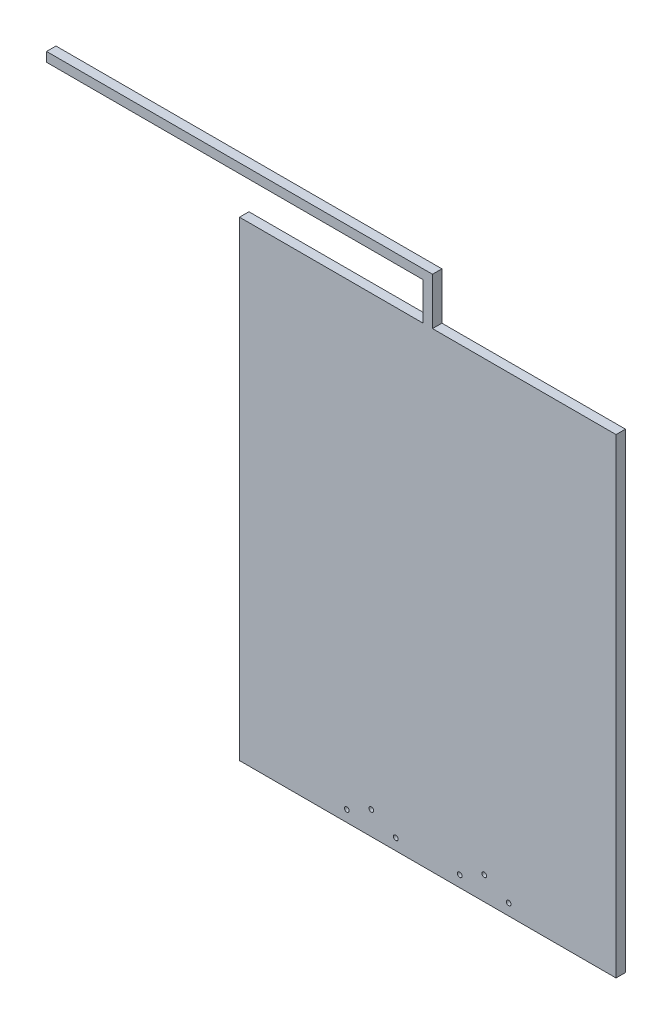
ISO-10303-21;
HEADER;
FILE_DESCRIPTION(('STEP AP214'),'2;1');
FILE_NAME('part.step','',(''),(''),'','','');
FILE_SCHEMA(('AUTOMOTIVE_DESIGN { 1 0 10303 214 1 1 1 1 }'));
ENDSEC;
DATA;
#1=APPLICATION_CONTEXT('core data for automotive mechanical design processes');
#2=APPLICATION_PROTOCOL_DEFINITION('international standard','automotive_design',2000,#1);
#3=PRODUCT_CONTEXT('',#1,'mechanical');
#4=PRODUCT('Part','Part','',(#3));
#5=PRODUCT_RELATED_PRODUCT_CATEGORY('part','',(#4));
#6=PRODUCT_DEFINITION_FORMATION('','',#4);
#7=PRODUCT_DEFINITION_CONTEXT('part definition',#1,'design');
#8=PRODUCT_DEFINITION('design','',#6,#7);
#9=PRODUCT_DEFINITION_SHAPE('','',#8);
#10=(LENGTH_UNIT() NAMED_UNIT(*) SI_UNIT(.MILLI.,.METRE.));
#11=(NAMED_UNIT(*) PLANE_ANGLE_UNIT() SI_UNIT($,.RADIAN.));
#12=(NAMED_UNIT(*) SI_UNIT($,.STERADIAN.) SOLID_ANGLE_UNIT());
#13=UNCERTAINTY_MEASURE_WITH_UNIT(LENGTH_MEASURE(1.E-05),#10,'distance_accuracy_value','');
#14=(GEOMETRIC_REPRESENTATION_CONTEXT(3) GLOBAL_UNCERTAINTY_ASSIGNED_CONTEXT((#13)) GLOBAL_UNIT_ASSIGNED_CONTEXT((#10,
#11,#12)) REPRESENTATION_CONTEXT('',''));
#15=CARTESIAN_POINT('',(0.,0.,0.));
#16=DIRECTION('',(0.,0.,1.));
#17=DIRECTION('',(1.,0.,0.));
#18=AXIS2_PLACEMENT_3D('',#15,#16,#17);
#19=CARTESIAN_POINT('',(-5.,300.,0.));
#20=DIRECTION('',(1.,0.,0.));
#21=DIRECTION('',(0.,1.,0.));
#22=AXIS2_PLACEMENT_3D('',#19,#20,#21);
#23=PLANE('',#22);
#24=DIRECTION('',(0.,0.,1.));
#25=VECTOR('',#24,1.);
#26=CARTESIAN_POINT('',(-5.,290.,0.));
#27=LINE('',#26,#25);
#28=CARTESIAN_POINT('',(-5.,290.,0.));
#29=VERTEX_POINT('',#28);
#30=CARTESIAN_POINT('',(-5.,290.,10.));
#31=VERTEX_POINT('',#30);
#32=EDGE_CURVE('E138',#29,#31,#27,.T.);
#33=ORIENTED_EDGE('',*,*,#32,.F.);
#34=DIRECTION('',(0.,-1.,0.));
#35=VECTOR('',#34,1.);
#36=CARTESIAN_POINT('',(-5.,300.,0.));
#37=LINE('',#36,#35);
#38=CARTESIAN_POINT('',(-4.99999999999998,250.,0.));
#39=VERTEX_POINT('',#38);
#40=EDGE_CURVE('E56',#29,#39,#37,.T.);
#41=ORIENTED_EDGE('',*,*,#40,.T.);
#42=DIRECTION('',(0.,0.,1.));
#43=VECTOR('',#42,1.);
#44=CARTESIAN_POINT('',(-4.99999999999999,250.,0.));
#45=LINE('',#44,#43);
#46=CARTESIAN_POINT('',(-4.99999999999999,250.,10.));
#47=VERTEX_POINT('',#46);
#48=EDGE_CURVE('E154',#39,#47,#45,.T.);
#49=ORIENTED_EDGE('',*,*,#48,.T.);
#50=DIRECTION('',(0.,-1.,0.));
#51=VECTOR('',#50,1.);
#52=CARTESIAN_POINT('',(-5.,300.,10.));
#53=LINE('',#52,#51);
#54=EDGE_CURVE('E159',#31,#47,#53,.T.);
#55=ORIENTED_EDGE('',*,*,#54,.F.);
#56=EDGE_LOOP('',(#33,#41,#49,#55));
#57=FACE_BOUND('',#56,.T.);
#58=ADVANCED_FACE('F33',(#57),#23,.F.);
#59=CARTESIAN_POINT('',(200.,250.,10.));
#60=DIRECTION('',(0.,-1.,0.));
#61=DIRECTION('',(1.,0.,0.));
#62=AXIS2_PLACEMENT_3D('',#59,#60,#61);
#63=PLANE('',#62);
#64=DIRECTION('',(0.,0.,-1.));
#65=VECTOR('',#64,1.);
#66=CARTESIAN_POINT('',(5.00000000000002,250.,0.));
#67=LINE('',#66,#65);
#68=CARTESIAN_POINT('',(5.,250.,10.));
#69=VERTEX_POINT('',#68);
#70=CARTESIAN_POINT('',(5.,250.,0.));
#71=VERTEX_POINT('',#70);
#72=EDGE_CURVE('E48',#69,#71,#67,.T.);
#73=ORIENTED_EDGE('',*,*,#72,.F.);
#74=DIRECTION('',(-1.,0.,0.));
#75=VECTOR('',#74,1.);
#76=CARTESIAN_POINT('',(200.,250.,10.));
#77=LINE('',#76,#75);
#78=CARTESIAN_POINT('',(200.,250.,10.));
#79=VERTEX_POINT('',#78);
#80=EDGE_CURVE('E210',#79,#69,#77,.T.);
#81=ORIENTED_EDGE('',*,*,#80,.F.);
#82=DIRECTION('',(0.,0.,-1.));
#83=VECTOR('',#82,1.);
#84=CARTESIAN_POINT('',(200.,250.,10.));
#85=LINE('',#84,#83);
#86=CARTESIAN_POINT('',(200.,250.,0.));
#87=VERTEX_POINT('',#86);
#88=EDGE_CURVE('E223',#79,#87,#85,.T.);
#89=ORIENTED_EDGE('',*,*,#88,.T.);
#90=DIRECTION('',(-1.,0.,0.));
#91=VECTOR('',#90,1.);
#92=CARTESIAN_POINT('',(200.,250.,0.));
#93=LINE('',#92,#91);
#94=EDGE_CURVE('E205',#87,#71,#93,.T.);
#95=ORIENTED_EDGE('',*,*,#94,.T.);
#96=EDGE_LOOP('',(#73,#81,#89,#95));
#97=FACE_BOUND('',#96,.T.);
#98=ADVANCED_FACE('F238',(#97),#63,.F.);
#99=ORIENTED_EDGE('',*,*,#48,.F.);
#100=CARTESIAN_POINT('',(-200.,250.,0.));
#101=VERTEX_POINT('',#100);
#102=EDGE_CURVE('E219',#39,#101,#93,.T.);
#103=ORIENTED_EDGE('',*,*,#102,.T.);
#104=DIRECTION('',(0.,0.,-1.));
#105=VECTOR('',#104,1.);
#106=CARTESIAN_POINT('',(-200.,250.,10.));
#107=LINE('',#106,#105);
#108=CARTESIAN_POINT('',(-200.,250.,10.));
#109=VERTEX_POINT('',#108);
#110=EDGE_CURVE('E212',#109,#101,#107,.T.);
#111=ORIENTED_EDGE('',*,*,#110,.F.);
#112=EDGE_CURVE('E209',#47,#109,#77,.T.);
#113=ORIENTED_EDGE('',*,*,#112,.F.);
#114=EDGE_LOOP('',(#99,#103,#111,#113));
#115=FACE_BOUND('',#114,.T.);
#116=ADVANCED_FACE('F261',(#115),#63,.F.);
#117=CARTESIAN_POINT('',(-200.,-250.,10.));
#118=DIRECTION('',(1.,0.,0.));
#119=DIRECTION('',(0.,0.,-1.));
#120=AXIS2_PLACEMENT_3D('',#117,#118,#119);
#121=PLANE('',#120);
#122=DIRECTION('',(0.,-1.,0.));
#123=VECTOR('',#122,1.);
#124=CARTESIAN_POINT('',(-200.,-250.,0.));
#125=LINE('',#124,#123);
#126=CARTESIAN_POINT('',(-200.,-250.,0.));
#127=VERTEX_POINT('',#126);
#128=EDGE_CURVE('E199',#101,#127,#125,.T.);
#129=ORIENTED_EDGE('',*,*,#128,.T.);
#130=DIRECTION('',(0.,0.,-1.));
#131=VECTOR('',#130,1.);
#132=CARTESIAN_POINT('',(-200.,-250.,10.));
#133=LINE('',#132,#131);
#134=CARTESIAN_POINT('',(-200.,-250.,10.));
#135=VERTEX_POINT('',#134);
#136=EDGE_CURVE('E11',#135,#127,#133,.T.);
#137=ORIENTED_EDGE('',*,*,#136,.F.);
#138=DIRECTION('',(0.,-1.,0.));
#139=VECTOR('',#138,1.);
#140=CARTESIAN_POINT('',(-200.,-250.,10.));
#141=LINE('',#140,#139);
#142=EDGE_CURVE('E202',#109,#135,#141,.T.);
#143=ORIENTED_EDGE('',*,*,#142,.F.);
#144=ORIENTED_EDGE('',*,*,#110,.T.);
#145=EDGE_LOOP('',(#129,#137,#143,#144));
#146=FACE_BOUND('',#145,.T.);
#147=ADVANCED_FACE('F35',(#146),#121,.F.);
#148=CARTESIAN_POINT('',(200.,-250.,10.));
#149=DIRECTION('',(0.,1.,0.));
#150=DIRECTION('',(0.,0.,1.));
#151=AXIS2_PLACEMENT_3D('',#148,#149,#150);
#152=PLANE('',#151);
#153=DIRECTION('',(1.,0.,0.));
#154=VECTOR('',#153,1.);
#155=CARTESIAN_POINT('',(200.,-250.,0.));
#156=LINE('',#155,#154);
#157=CARTESIAN_POINT('',(200.,-250.,0.));
#158=VERTEX_POINT('',#157);
#159=EDGE_CURVE('E215',#127,#158,#156,.T.);
#160=ORIENTED_EDGE('',*,*,#159,.T.);
#161=DIRECTION('',(0.,0.,-1.));
#162=VECTOR('',#161,1.);
#163=CARTESIAN_POINT('',(200.,-250.,10.));
#164=LINE('',#163,#162);
#165=CARTESIAN_POINT('',(200.,-250.,10.));
#166=VERTEX_POINT('',#165);
#167=EDGE_CURVE('E41',#166,#158,#164,.T.);
#168=ORIENTED_EDGE('',*,*,#167,.F.);
#169=DIRECTION('',(1.,0.,0.));
#170=VECTOR('',#169,1.);
#171=CARTESIAN_POINT('',(200.,-250.,10.));
#172=LINE('',#171,#170);
#173=EDGE_CURVE('E204',#135,#166,#172,.T.);
#174=ORIENTED_EDGE('',*,*,#173,.F.);
#175=ORIENTED_EDGE('',*,*,#136,.T.);
#176=EDGE_LOOP('',(#160,#168,#174,#175));
#177=FACE_BOUND('',#176,.T.);
#178=ADVANCED_FACE('F403',(#177),#152,.F.);
#179=CARTESIAN_POINT('',(200.,-250.,10.));
#180=DIRECTION('',(-1.,0.,0.));
#181=DIRECTION('',(0.,0.,1.));
#182=AXIS2_PLACEMENT_3D('',#179,#180,#181);
#183=PLANE('',#182);
#184=DIRECTION('',(0.,1.,0.));
#185=VECTOR('',#184,1.);
#186=CARTESIAN_POINT('',(200.,-250.,0.));
#187=LINE('',#186,#185);
#188=EDGE_CURVE('E217',#158,#87,#187,.T.);
#189=ORIENTED_EDGE('',*,*,#188,.T.);
#190=ORIENTED_EDGE('',*,*,#88,.F.);
#191=DIRECTION('',(0.,1.,0.));
#192=VECTOR('',#191,1.);
#193=CARTESIAN_POINT('',(200.,-250.,10.));
#194=LINE('',#193,#192);
#195=EDGE_CURVE('E207',#166,#79,#194,.T.);
#196=ORIENTED_EDGE('',*,*,#195,.F.);
#197=ORIENTED_EDGE('',*,*,#167,.T.);
#198=EDGE_LOOP('',(#189,#190,#196,#197));
#199=FACE_BOUND('',#198,.T.);
#200=ADVANCED_FACE('F230',(#199),#183,.F.);
#201=CARTESIAN_POINT('',(0.,0.,10.));
#202=DIRECTION('',(0.,0.,1.));
#203=DIRECTION('',(1.,0.,0.));
#204=AXIS2_PLACEMENT_3D('',#201,#202,#203);
#205=PLANE('',#204);
#206=CARTESIAN_POINT('',(-60.,-225.,10.));
#207=DIRECTION('',(0.,0.,1.));
#208=DIRECTION('',(1.,0.,0.));
#209=AXIS2_PLACEMENT_3D('',#206,#207,#208);
#210=CIRCLE('',#209,2.5);
#211=CARTESIAN_POINT('',(-57.5,-225.,10.));
#212=VERTEX_POINT('',#211);
#213=EDGE_CURVE('E170',#212,#212,#210,.T.);
#214=ORIENTED_EDGE('',*,*,#213,.F.);
#215=EDGE_LOOP('',(#214));
#216=FACE_BOUND('',#215,.T.);
#217=CARTESIAN_POINT('',(-34.,-238.,10.));
#218=DIRECTION('',(0.,0.,1.));
#219=DIRECTION('',(1.,0.,0.));
#220=AXIS2_PLACEMENT_3D('',#217,#218,#219);
#221=CIRCLE('',#220,2.5);
#222=CARTESIAN_POINT('',(-31.5,-238.,10.));
#223=VERTEX_POINT('',#222);
#224=EDGE_CURVE('E176',#223,#223,#221,.T.);
#225=ORIENTED_EDGE('',*,*,#224,.F.);
#226=EDGE_LOOP('',(#225));
#227=FACE_BOUND('',#226,.T.);
#228=CARTESIAN_POINT('',(34.0000000000001,-238.,10.));
#229=DIRECTION('',(0.,0.,1.));
#230=DIRECTION('',(1.,0.,0.));
#231=AXIS2_PLACEMENT_3D('',#228,#229,#230);
#232=CIRCLE('',#231,2.5);
#233=CARTESIAN_POINT('',(36.5000000000001,-238.,10.));
#234=VERTEX_POINT('',#233);
#235=EDGE_CURVE('E182',#234,#234,#232,.T.);
#236=ORIENTED_EDGE('',*,*,#235,.F.);
#237=EDGE_LOOP('',(#236));
#238=FACE_BOUND('',#237,.T.);
#239=CARTESIAN_POINT('',(60.0000000000001,-225.,10.));
#240=DIRECTION('',(0.,0.,1.));
#241=DIRECTION('',(1.,0.,0.));
#242=AXIS2_PLACEMENT_3D('',#239,#240,#241);
#243=CIRCLE('',#242,2.5);
#244=CARTESIAN_POINT('',(62.5000000000001,-225.,10.));
#245=VERTEX_POINT('',#244);
#246=EDGE_CURVE('E188',#245,#245,#243,.T.);
#247=ORIENTED_EDGE('',*,*,#246,.F.);
#248=EDGE_LOOP('',(#247));
#249=FACE_BOUND('',#248,.T.);
#250=CARTESIAN_POINT('',(86.0000000000001,-238.,10.));
#251=DIRECTION('',(0.,0.,1.));
#252=DIRECTION('',(1.,0.,0.));
#253=AXIS2_PLACEMENT_3D('',#250,#251,#252);
#254=CIRCLE('',#253,2.5);
#255=CARTESIAN_POINT('',(88.5000000000001,-238.,10.));
#256=VERTEX_POINT('',#255);
#257=EDGE_CURVE('E165',#256,#256,#254,.T.);
#258=ORIENTED_EDGE('',*,*,#257,.F.);
#259=EDGE_LOOP('',(#258));
#260=FACE_BOUND('',#259,.T.);
#261=CARTESIAN_POINT('',(-86.,-238.,10.));
#262=DIRECTION('',(0.,0.,1.));
#263=DIRECTION('',(1.,0.,0.));
#264=AXIS2_PLACEMENT_3D('',#261,#262,#263);
#265=CIRCLE('',#264,2.50000000000001);
#266=CARTESIAN_POINT('',(-83.5,-238.,10.));
#267=VERTEX_POINT('',#266);
#268=EDGE_CURVE('E169',#267,#267,#265,.T.);
#269=ORIENTED_EDGE('',*,*,#268,.F.);
#270=EDGE_LOOP('',(#269));
#271=FACE_BOUND('',#270,.T.);
#272=ORIENTED_EDGE('',*,*,#142,.T.);
#273=ORIENTED_EDGE('',*,*,#173,.T.);
#274=ORIENTED_EDGE('',*,*,#195,.T.);
#275=ORIENTED_EDGE('',*,*,#80,.T.);
#276=DIRECTION('',(0.,-1.,0.));
#277=VECTOR('',#276,1.);
#278=CARTESIAN_POINT('',(5.,300.,10.));
#279=LINE('',#278,#277);
#280=CARTESIAN_POINT('',(5.,300.,10.));
#281=VERTEX_POINT('',#280);
#282=EDGE_CURVE('E121',#281,#69,#279,.T.);
#283=ORIENTED_EDGE('',*,*,#282,.F.);
#284=DIRECTION('',(1.,0.,0.));
#285=VECTOR('',#284,1.);
#286=CARTESIAN_POINT('',(-5.,300.,10.));
#287=LINE('',#286,#285);
#288=CARTESIAN_POINT('',(-405.,300.,10.0000000000001));
#289=VERTEX_POINT('',#288);
#290=EDGE_CURVE('E113',#289,#281,#287,.T.);
#291=ORIENTED_EDGE('',*,*,#290,.F.);
#292=DIRECTION('',(0.,1.,0.));
#293=VECTOR('',#292,1.);
#294=CARTESIAN_POINT('',(-405.,300.,10.0000000000001));
#295=LINE('',#294,#293);
#296=CARTESIAN_POINT('',(-405.,290.,10.0000000000001));
#297=VERTEX_POINT('',#296);
#298=EDGE_CURVE('E119',#297,#289,#295,.T.);
#299=ORIENTED_EDGE('',*,*,#298,.F.);
#300=DIRECTION('',(1.,0.,0.));
#301=VECTOR('',#300,1.);
#302=CARTESIAN_POINT('',(-405.,290.,10.0000000000001));
#303=LINE('',#302,#301);
#304=EDGE_CURVE('E147',#297,#31,#303,.T.);
#305=ORIENTED_EDGE('',*,*,#304,.T.);
#306=ORIENTED_EDGE('',*,*,#54,.T.);
#307=ORIENTED_EDGE('',*,*,#112,.T.);
#308=EDGE_LOOP('',(#272,#273,#274,#275,#283,#291,#299,#305,#306,#307));
#309=FACE_BOUND('',#308,.T.);
#310=ADVANCED_FACE('F116',(#216,#227,#238,#249,#260,#271,#309),#205,.T.);
#311=CARTESIAN_POINT('',(0.,0.,0.));
#312=DIRECTION('',(0.,0.,1.));
#313=DIRECTION('',(1.,0.,0.));
#314=AXIS2_PLACEMENT_3D('',#311,#312,#313);
#315=PLANE('',#314);
#316=CARTESIAN_POINT('',(-60.,-225.,0.));
#317=DIRECTION('',(0.,0.,1.));
#318=DIRECTION('',(1.,0.,0.));
#319=AXIS2_PLACEMENT_3D('',#316,#317,#318);
#320=CIRCLE('',#319,2.5);
#321=CARTESIAN_POINT('',(-57.5,-225.,0.));
#322=VERTEX_POINT('',#321);
#323=EDGE_CURVE('E166',#322,#322,#320,.T.);
#324=ORIENTED_EDGE('',*,*,#323,.T.);
#325=EDGE_LOOP('',(#324));
#326=FACE_BOUND('',#325,.T.);
#327=CARTESIAN_POINT('',(-34.,-238.,0.));
#328=DIRECTION('',(0.,0.,1.));
#329=DIRECTION('',(1.,0.,0.));
#330=AXIS2_PLACEMENT_3D('',#327,#328,#329);
#331=CIRCLE('',#330,2.5);
#332=CARTESIAN_POINT('',(-31.5,-238.,0.));
#333=VERTEX_POINT('',#332);
#334=EDGE_CURVE('E173',#333,#333,#331,.T.);
#335=ORIENTED_EDGE('',*,*,#334,.T.);
#336=EDGE_LOOP('',(#335));
#337=FACE_BOUND('',#336,.T.);
#338=CARTESIAN_POINT('',(34.0000000000001,-238.,0.));
#339=DIRECTION('',(0.,0.,1.));
#340=DIRECTION('',(1.,0.,0.));
#341=AXIS2_PLACEMENT_3D('',#338,#339,#340);
#342=CIRCLE('',#341,2.5);
#343=CARTESIAN_POINT('',(36.5000000000001,-238.,0.));
#344=VERTEX_POINT('',#343);
#345=EDGE_CURVE('E179',#344,#344,#342,.T.);
#346=ORIENTED_EDGE('',*,*,#345,.T.);
#347=EDGE_LOOP('',(#346));
#348=FACE_BOUND('',#347,.T.);
#349=CARTESIAN_POINT('',(60.0000000000001,-225.,0.));
#350=DIRECTION('',(0.,0.,1.));
#351=DIRECTION('',(1.,0.,0.));
#352=AXIS2_PLACEMENT_3D('',#349,#350,#351);
#353=CIRCLE('',#352,2.5);
#354=CARTESIAN_POINT('',(62.5000000000001,-225.,0.));
#355=VERTEX_POINT('',#354);
#356=EDGE_CURVE('E185',#355,#355,#353,.T.);
#357=ORIENTED_EDGE('',*,*,#356,.T.);
#358=EDGE_LOOP('',(#357));
#359=FACE_BOUND('',#358,.T.);
#360=CARTESIAN_POINT('',(86.0000000000001,-238.,0.));
#361=DIRECTION('',(0.,0.,1.));
#362=DIRECTION('',(1.,0.,0.));
#363=AXIS2_PLACEMENT_3D('',#360,#361,#362);
#364=CIRCLE('',#363,2.5);
#365=CARTESIAN_POINT('',(88.5000000000001,-238.,0.));
#366=VERTEX_POINT('',#365);
#367=EDGE_CURVE('E191',#366,#366,#364,.T.);
#368=ORIENTED_EDGE('',*,*,#367,.T.);
#369=EDGE_LOOP('',(#368));
#370=FACE_BOUND('',#369,.T.);
#371=CARTESIAN_POINT('',(-86.,-238.,0.));
#372=DIRECTION('',(0.,0.,1.));
#373=DIRECTION('',(1.,0.,0.));
#374=AXIS2_PLACEMENT_3D('',#371,#372,#373);
#375=CIRCLE('',#374,2.50000000000001);
#376=CARTESIAN_POINT('',(-83.5,-238.,0.));
#377=VERTEX_POINT('',#376);
#378=EDGE_CURVE('E196',#377,#377,#375,.T.);
#379=ORIENTED_EDGE('',*,*,#378,.T.);
#380=EDGE_LOOP('',(#379));
#381=FACE_BOUND('',#380,.T.);
#382=ORIENTED_EDGE('',*,*,#128,.F.);
#383=ORIENTED_EDGE('',*,*,#102,.F.);
#384=ORIENTED_EDGE('',*,*,#40,.F.);
#385=DIRECTION('',(1.,0.,0.));
#386=VECTOR('',#385,1.);
#387=CARTESIAN_POINT('',(-405.,290.,0.));
#388=LINE('',#387,#386);
#389=CARTESIAN_POINT('',(-405.,290.,0.));
#390=VERTEX_POINT('',#389);
#391=EDGE_CURVE('E150',#390,#29,#388,.T.);
#392=ORIENTED_EDGE('',*,*,#391,.F.);
#393=DIRECTION('',(0.,-1.,0.));
#394=VECTOR('',#393,1.);
#395=CARTESIAN_POINT('',(-405.,300.,0.));
#396=LINE('',#395,#394);
#397=CARTESIAN_POINT('',(-405.,300.,0.));
#398=VERTEX_POINT('',#397);
#399=EDGE_CURVE('E132',#398,#390,#396,.T.);
#400=ORIENTED_EDGE('',*,*,#399,.F.);
#401=DIRECTION('',(-1.,0.,0.));
#402=VECTOR('',#401,1.);
#403=CARTESIAN_POINT('',(-5.,300.,0.));
#404=LINE('',#403,#402);
#405=CARTESIAN_POINT('',(5.,300.,0.));
#406=VERTEX_POINT('',#405);
#407=EDGE_CURVE('E125',#406,#398,#404,.T.);
#408=ORIENTED_EDGE('',*,*,#407,.F.);
#409=DIRECTION('',(0.,-1.,0.));
#410=VECTOR('',#409,1.);
#411=CARTESIAN_POINT('',(5.,300.,0.));
#412=LINE('',#411,#410);
#413=EDGE_CURVE('E162',#406,#71,#412,.T.);
#414=ORIENTED_EDGE('',*,*,#413,.T.);
#415=ORIENTED_EDGE('',*,*,#94,.F.);
#416=ORIENTED_EDGE('',*,*,#188,.F.);
#417=ORIENTED_EDGE('',*,*,#159,.F.);
#418=EDGE_LOOP('',(#382,#383,#384,#392,#400,#408,#414,#415,#416,#417));
#419=FACE_BOUND('',#418,.T.);
#420=ADVANCED_FACE('F236',(#326,#337,#348,#359,#370,#381,#419),#315,.F.);
#421=CARTESIAN_POINT('',(-86.,-238.,0.));
#422=DIRECTION('',(0.,0.,1.));
#423=DIRECTION('',(1.,0.,0.));
#424=AXIS2_PLACEMENT_3D('',#421,#422,#423);
#425=CYLINDRICAL_SURFACE('',#424,2.50000000000001);
#426=ORIENTED_EDGE('',*,*,#378,.F.);
#427=EDGE_LOOP('',(#426));
#428=FACE_BOUND('',#427,.T.);
#429=ORIENTED_EDGE('',*,*,#268,.T.);
#430=EDGE_LOOP('',(#429));
#431=FACE_BOUND('',#430,.T.);
#432=ADVANCED_FACE('F309',(#428,#431),#425,.F.);
#433=CARTESIAN_POINT('',(86.0000000000001,-238.,0.));
#434=DIRECTION('',(0.,0.,1.));
#435=DIRECTION('',(1.,0.,0.));
#436=AXIS2_PLACEMENT_3D('',#433,#434,#435);
#437=CYLINDRICAL_SURFACE('',#436,2.5);
#438=ORIENTED_EDGE('',*,*,#367,.F.);
#439=EDGE_LOOP('',(#438));
#440=FACE_BOUND('',#439,.T.);
#441=ORIENTED_EDGE('',*,*,#257,.T.);
#442=EDGE_LOOP('',(#441));
#443=FACE_BOUND('',#442,.T.);
#444=ADVANCED_FACE('F374',(#440,#443),#437,.F.);
#445=CARTESIAN_POINT('',(60.0000000000001,-225.,0.));
#446=DIRECTION('',(0.,0.,1.));
#447=DIRECTION('',(1.,0.,0.));
#448=AXIS2_PLACEMENT_3D('',#445,#446,#447);
#449=CYLINDRICAL_SURFACE('',#448,2.5);
#450=ORIENTED_EDGE('',*,*,#356,.F.);
#451=EDGE_LOOP('',(#450));
#452=FACE_BOUND('',#451,.T.);
#453=ORIENTED_EDGE('',*,*,#246,.T.);
#454=EDGE_LOOP('',(#453));
#455=FACE_BOUND('',#454,.T.);
#456=ADVANCED_FACE('F364',(#452,#455),#449,.F.);
#457=CARTESIAN_POINT('',(34.0000000000001,-238.,0.));
#458=DIRECTION('',(0.,0.,1.));
#459=DIRECTION('',(1.,0.,0.));
#460=AXIS2_PLACEMENT_3D('',#457,#458,#459);
#461=CYLINDRICAL_SURFACE('',#460,2.5);
#462=ORIENTED_EDGE('',*,*,#345,.F.);
#463=EDGE_LOOP('',(#462));
#464=FACE_BOUND('',#463,.T.);
#465=ORIENTED_EDGE('',*,*,#235,.T.);
#466=EDGE_LOOP('',(#465));
#467=FACE_BOUND('',#466,.T.);
#468=ADVANCED_FACE('F354',(#464,#467),#461,.F.);
#469=CARTESIAN_POINT('',(-34.,-238.,0.));
#470=DIRECTION('',(0.,0.,1.));
#471=DIRECTION('',(1.,0.,0.));
#472=AXIS2_PLACEMENT_3D('',#469,#470,#471);
#473=CYLINDRICAL_SURFACE('',#472,2.5);
#474=ORIENTED_EDGE('',*,*,#334,.F.);
#475=EDGE_LOOP('',(#474));
#476=FACE_BOUND('',#475,.T.);
#477=ORIENTED_EDGE('',*,*,#224,.T.);
#478=EDGE_LOOP('',(#477));
#479=FACE_BOUND('',#478,.T.);
#480=ADVANCED_FACE('F251',(#476,#479),#473,.F.);
#481=CARTESIAN_POINT('',(-60.,-225.,0.));
#482=DIRECTION('',(0.,0.,1.));
#483=DIRECTION('',(1.,0.,0.));
#484=AXIS2_PLACEMENT_3D('',#481,#482,#483);
#485=CYLINDRICAL_SURFACE('',#484,2.5);
#486=ORIENTED_EDGE('',*,*,#323,.F.);
#487=EDGE_LOOP('',(#486));
#488=FACE_BOUND('',#487,.T.);
#489=ORIENTED_EDGE('',*,*,#213,.T.);
#490=EDGE_LOOP('',(#489));
#491=FACE_BOUND('',#490,.T.);
#492=ADVANCED_FACE('F242',(#488,#491),#485,.F.);
#493=CARTESIAN_POINT('',(5.,300.,0.));
#494=DIRECTION('',(-1.,0.,0.));
#495=DIRECTION('',(0.,-1.,0.));
#496=AXIS2_PLACEMENT_3D('',#493,#494,#495);
#497=PLANE('',#496);
#498=ORIENTED_EDGE('',*,*,#72,.T.);
#499=ORIENTED_EDGE('',*,*,#413,.F.);
#500=DIRECTION('',(0.,0.,-1.));
#501=VECTOR('',#500,1.);
#502=CARTESIAN_POINT('',(5.,300.,0.));
#503=LINE('',#502,#501);
#504=EDGE_CURVE('E152',#281,#406,#503,.T.);
#505=ORIENTED_EDGE('',*,*,#504,.F.);
#506=ORIENTED_EDGE('',*,*,#282,.T.);
#507=EDGE_LOOP('',(#498,#499,#505,#506));
#508=FACE_BOUND('',#507,.T.);
#509=ADVANCED_FACE('F240',(#508),#497,.F.);
#510=CARTESIAN_POINT('',(0.,300.,0.));
#511=DIRECTION('',(0.,1.,0.));
#512=DIRECTION('',(0.,0.,1.));
#513=AXIS2_PLACEMENT_3D('',#510,#511,#512);
#514=PLANE('',#513);
#515=ORIENTED_EDGE('',*,*,#504,.T.);
#516=ORIENTED_EDGE('',*,*,#407,.T.);
#517=DIRECTION('',(0.,0.,-1.));
#518=VECTOR('',#517,1.);
#519=CARTESIAN_POINT('',(-405.,300.,0.));
#520=LINE('',#519,#518);
#521=EDGE_CURVE('E128',#289,#398,#520,.T.);
#522=ORIENTED_EDGE('',*,*,#521,.F.);
#523=ORIENTED_EDGE('',*,*,#290,.T.);
#524=EDGE_LOOP('',(#515,#516,#522,#523));
#525=FACE_BOUND('',#524,.T.);
#526=ADVANCED_FACE('F129',(#525),#514,.T.);
#527=CARTESIAN_POINT('',(-405.,290.,0.));
#528=DIRECTION('',(0.,1.,0.));
#529=DIRECTION('',(-1.,0.,0.));
#530=AXIS2_PLACEMENT_3D('',#527,#528,#529);
#531=PLANE('',#530);
#532=ORIENTED_EDGE('',*,*,#32,.T.);
#533=ORIENTED_EDGE('',*,*,#304,.F.);
#534=DIRECTION('',(0.,0.,1.));
#535=VECTOR('',#534,1.);
#536=CARTESIAN_POINT('',(-405.,290.,0.));
#537=LINE('',#536,#535);
#538=EDGE_CURVE('E136',#390,#297,#537,.T.);
#539=ORIENTED_EDGE('',*,*,#538,.F.);
#540=ORIENTED_EDGE('',*,*,#391,.T.);
#541=EDGE_LOOP('',(#532,#533,#539,#540));
#542=FACE_BOUND('',#541,.T.);
#543=ADVANCED_FACE('F248',(#542),#531,.F.);
#544=CARTESIAN_POINT('',(-405.,-1.12323345069498E-13,0.));
#545=DIRECTION('',(-1.,0.,0.));
#546=DIRECTION('',(0.,-1.,0.));
#547=AXIS2_PLACEMENT_3D('',#544,#545,#546);
#548=PLANE('',#547);
#549=CARTESIAN_POINT('',(-405.,295.,5.00000000000007));
#550=DIRECTION('',(-1.,0.,0.));
#551=DIRECTION('',(0.,-1.,0.));
#552=AXIS2_PLACEMENT_3D('',#549,#550,#551);
#553=CIRCLE('',#552,2.5);
#554=CARTESIAN_POINT('',(-405.,292.5,5.00000000000007));
#555=VERTEX_POINT('',#554);
#556=EDGE_CURVE('E143',#555,#555,#553,.T.);
#557=ORIENTED_EDGE('',*,*,#556,.F.);
#558=EDGE_LOOP('',(#557));
#559=FACE_BOUND('',#558,.T.);
#560=ORIENTED_EDGE('',*,*,#298,.T.);
#561=ORIENTED_EDGE('',*,*,#521,.T.);
#562=ORIENTED_EDGE('',*,*,#399,.T.);
#563=ORIENTED_EDGE('',*,*,#538,.T.);
#564=EDGE_LOOP('',(#560,#561,#562,#563));
#565=FACE_BOUND('',#564,.T.);
#566=ADVANCED_FACE('F134',(#559,#565),#548,.T.);
#567=CARTESIAN_POINT('',(-395.,295.,5.00000000000007));
#568=DIRECTION('',(-1.,0.,0.));
#569=DIRECTION('',(0.,-1.,0.));
#570=AXIS2_PLACEMENT_3D('',#567,#568,#569);
#571=CYLINDRICAL_SURFACE('',#570,2.5);
#572=CARTESIAN_POINT('',(-395.,295.,5.00000000000007));
#573=DIRECTION('',(-1.,0.,0.));
#574=DIRECTION('',(0.,-1.,0.));
#575=AXIS2_PLACEMENT_3D('',#572,#573,#574);
#576=CIRCLE('',#575,2.5);
#577=CARTESIAN_POINT('',(-395.,292.5,5.00000000000007));
#578=VERTEX_POINT('',#577);
#579=EDGE_CURVE('E140',#578,#578,#576,.T.);
#580=ORIENTED_EDGE('',*,*,#579,.F.);
#581=EDGE_LOOP('',(#580));
#582=FACE_BOUND('',#581,.T.);
#583=ORIENTED_EDGE('',*,*,#556,.T.);
#584=EDGE_LOOP('',(#583));
#585=FACE_BOUND('',#584,.T.);
#586=ADVANCED_FACE('F269',(#582,#585),#571,.F.);
#587=CARTESIAN_POINT('',(-395.,295.,5.00000000000007));
#588=DIRECTION('',(-1.,0.,0.));
#589=DIRECTION('',(0.,-1.,0.));
#590=AXIS2_PLACEMENT_3D('',#587,#588,#589);
#591=PLANE('',#590);
#592=ORIENTED_EDGE('',*,*,#579,.T.);
#593=EDGE_LOOP('',(#592));
#594=FACE_BOUND('',#593,.T.);
#595=ADVANCED_FACE('F273',(#594),#591,.T.);
#596=CLOSED_SHELL('',(#58,#98,#116,#147,#178,#200,#310,#420,#432,#444,#456,#468,#480,#492,#509,
#526,#543,#566,#586,#595));
#597=MANIFOLD_SOLID_BREP('B2',#596);
#598=ADVANCED_BREP_SHAPE_REPRESENTATION('',(#18,#597),#14);
#599=SHAPE_DEFINITION_REPRESENTATION(#9,#598);
ENDSEC;
END-ISO-10303-21;
